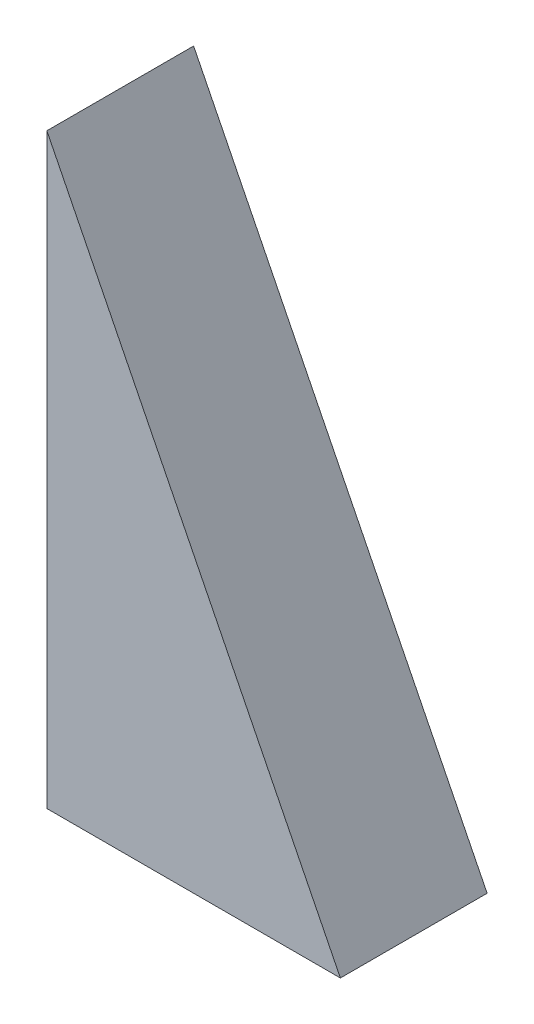
ISO-10303-21;
HEADER;
FILE_DESCRIPTION(('STEP AP214'),'2;1');
FILE_NAME('part.step','',(''),(''),'','','');
FILE_SCHEMA(('AUTOMOTIVE_DESIGN { 1 0 10303 214 1 1 1 1 }'));
ENDSEC;
DATA;
#1=APPLICATION_CONTEXT('core data for automotive mechanical design processes');
#2=APPLICATION_PROTOCOL_DEFINITION('international standard','automotive_design',2000,#1);
#3=PRODUCT_CONTEXT('',#1,'mechanical');
#4=PRODUCT('Part','Part','',(#3));
#5=PRODUCT_RELATED_PRODUCT_CATEGORY('part','',(#4));
#6=PRODUCT_DEFINITION_FORMATION('','',#4);
#7=PRODUCT_DEFINITION_CONTEXT('part definition',#1,'design');
#8=PRODUCT_DEFINITION('design','',#6,#7);
#9=PRODUCT_DEFINITION_SHAPE('','',#8);
#10=(LENGTH_UNIT() NAMED_UNIT(*) SI_UNIT(.MILLI.,.METRE.));
#11=(NAMED_UNIT(*) PLANE_ANGLE_UNIT() SI_UNIT($,.RADIAN.));
#12=(NAMED_UNIT(*) SI_UNIT($,.STERADIAN.) SOLID_ANGLE_UNIT());
#13=UNCERTAINTY_MEASURE_WITH_UNIT(LENGTH_MEASURE(1.E-05),#10,'distance_accuracy_value','');
#14=(GEOMETRIC_REPRESENTATION_CONTEXT(3) GLOBAL_UNCERTAINTY_ASSIGNED_CONTEXT((#13)) GLOBAL_UNIT_ASSIGNED_CONTEXT((#10,
#11,#12)) REPRESENTATION_CONTEXT('',''));
#15=CARTESIAN_POINT('',(0.,0.,0.));
#16=DIRECTION('',(0.,0.,1.));
#17=DIRECTION('',(1.,0.,0.));
#18=AXIS2_PLACEMENT_3D('',#15,#16,#17);
#19=CARTESIAN_POINT('',(20.,0.,10.));
#20=DIRECTION('',(0.,1.,0.));
#21=DIRECTION('',(-1.,0.,0.));
#22=AXIS2_PLACEMENT_3D('',#19,#20,#21);
#23=PLANE('',#22);
#24=DIRECTION('',(1.,0.,0.));
#25=VECTOR('',#24,1.);
#26=CARTESIAN_POINT('',(20.,0.,0.));
#27=LINE('',#26,#25);
#28=CARTESIAN_POINT('',(0.,0.,0.));
#29=VERTEX_POINT('',#28);
#30=CARTESIAN_POINT('',(20.,0.,0.));
#31=VERTEX_POINT('',#30);
#32=EDGE_CURVE('E84',#29,#31,#27,.T.);
#33=ORIENTED_EDGE('',*,*,#32,.T.);
#34=DIRECTION('',(0.,0.,-1.));
#35=VECTOR('',#34,1.);
#36=CARTESIAN_POINT('',(20.,0.,10.));
#37=LINE('',#36,#35);
#38=CARTESIAN_POINT('',(20.,0.,10.));
#39=VERTEX_POINT('',#38);
#40=EDGE_CURVE('E11',#39,#31,#37,.T.);
#41=ORIENTED_EDGE('',*,*,#40,.F.);
#42=DIRECTION('',(1.,0.,0.));
#43=VECTOR('',#42,1.);
#44=CARTESIAN_POINT('',(20.,0.,10.));
#45=LINE('',#44,#43);
#46=CARTESIAN_POINT('',(0.,0.,10.));
#47=VERTEX_POINT('',#46);
#48=EDGE_CURVE('E77',#47,#39,#45,.T.);
#49=ORIENTED_EDGE('',*,*,#48,.F.);
#50=DIRECTION('',(0.,0.,-1.));
#51=VECTOR('',#50,1.);
#52=CARTESIAN_POINT('',(0.,0.,10.));
#53=LINE('',#52,#51);
#54=EDGE_CURVE('E85',#47,#29,#53,.T.);
#55=ORIENTED_EDGE('',*,*,#54,.T.);
#56=EDGE_LOOP('',(#33,#41,#49,#55));
#57=FACE_BOUND('',#56,.T.);
#58=ADVANCED_FACE('F37',(#57),#23,.F.);
#59=CARTESIAN_POINT('',(0.,40.,10.));
#60=DIRECTION('',(-0.894427190999916,-0.447213595499958,0.));
#61=DIRECTION('',(0.447213595499958,-0.894427190999916,0.));
#62=AXIS2_PLACEMENT_3D('',#59,#60,#61);
#63=PLANE('',#62);
#64=DIRECTION('',(-0.447213595499958,0.894427190999916,0.));
#65=VECTOR('',#64,1.);
#66=CARTESIAN_POINT('',(0.,40.,0.));
#67=LINE('',#66,#65);
#68=CARTESIAN_POINT('',(0.,40.,0.));
#69=VERTEX_POINT('',#68);
#70=EDGE_CURVE('E65',#31,#69,#67,.T.);
#71=ORIENTED_EDGE('',*,*,#70,.T.);
#72=DIRECTION('',(0.,0.,-1.));
#73=VECTOR('',#72,1.);
#74=CARTESIAN_POINT('',(0.,40.,10.));
#75=LINE('',#74,#73);
#76=CARTESIAN_POINT('',(0.,40.,10.));
#77=VERTEX_POINT('',#76);
#78=EDGE_CURVE('E45',#77,#69,#75,.T.);
#79=ORIENTED_EDGE('',*,*,#78,.F.);
#80=DIRECTION('',(-0.447213595499958,0.894427190999916,0.));
#81=VECTOR('',#80,1.);
#82=CARTESIAN_POINT('',(0.,40.,10.));
#83=LINE('',#82,#81);
#84=EDGE_CURVE('E73',#39,#77,#83,.T.);
#85=ORIENTED_EDGE('',*,*,#84,.F.);
#86=ORIENTED_EDGE('',*,*,#40,.T.);
#87=EDGE_LOOP('',(#71,#79,#85,#86));
#88=FACE_BOUND('',#87,.T.);
#89=ADVANCED_FACE('F74',(#88),#63,.F.);
#90=CARTESIAN_POINT('',(0.,0.,10.));
#91=DIRECTION('',(1.,0.,0.));
#92=DIRECTION('',(0.,0.,-1.));
#93=AXIS2_PLACEMENT_3D('',#90,#91,#92);
#94=PLANE('',#93);
#95=DIRECTION('',(0.,-1.,0.));
#96=VECTOR('',#95,1.);
#97=CARTESIAN_POINT('',(0.,0.,0.));
#98=LINE('',#97,#96);
#99=EDGE_CURVE('E70',#69,#29,#98,.T.);
#100=ORIENTED_EDGE('',*,*,#99,.T.);
#101=ORIENTED_EDGE('',*,*,#54,.F.);
#102=DIRECTION('',(0.,-1.,0.));
#103=VECTOR('',#102,1.);
#104=CARTESIAN_POINT('',(0.,0.,10.));
#105=LINE('',#104,#103);
#106=EDGE_CURVE('E53',#77,#47,#105,.T.);
#107=ORIENTED_EDGE('',*,*,#106,.F.);
#108=ORIENTED_EDGE('',*,*,#78,.T.);
#109=EDGE_LOOP('',(#100,#101,#107,#108));
#110=FACE_BOUND('',#109,.T.);
#111=ADVANCED_FACE('F92',(#110),#94,.F.);
#112=CARTESIAN_POINT('',(0.,0.,10.));
#113=DIRECTION('',(0.,0.,-1.));
#114=DIRECTION('',(-1.,0.,0.));
#115=AXIS2_PLACEMENT_3D('',#112,#113,#114);
#116=PLANE('',#115);
#117=ORIENTED_EDGE('',*,*,#48,.T.);
#118=ORIENTED_EDGE('',*,*,#84,.T.);
#119=ORIENTED_EDGE('',*,*,#106,.T.);
#120=EDGE_LOOP('',(#117,#118,#119));
#121=FACE_BOUND('',#120,.T.);
#122=ADVANCED_FACE('F80',(#121),#116,.F.);
#123=CARTESIAN_POINT('',(0.,0.,0.));
#124=DIRECTION('',(0.,0.,-1.));
#125=DIRECTION('',(-1.,0.,0.));
#126=AXIS2_PLACEMENT_3D('',#123,#124,#125);
#127=PLANE('',#126);
#128=ORIENTED_EDGE('',*,*,#32,.F.);
#129=ORIENTED_EDGE('',*,*,#99,.F.);
#130=ORIENTED_EDGE('',*,*,#70,.F.);
#131=EDGE_LOOP('',(#128,#129,#130));
#132=FACE_BOUND('',#131,.T.);
#133=ADVANCED_FACE('F93',(#132),#127,.T.);
#134=CLOSED_SHELL('',(#58,#89,#111,#122,#133));
#135=MANIFOLD_SOLID_BREP('B2',#134);
#136=ADVANCED_BREP_SHAPE_REPRESENTATION('',(#18,#135),#14);
#137=SHAPE_DEFINITION_REPRESENTATION(#9,#136);
ENDSEC;
END-ISO-10303-21;
